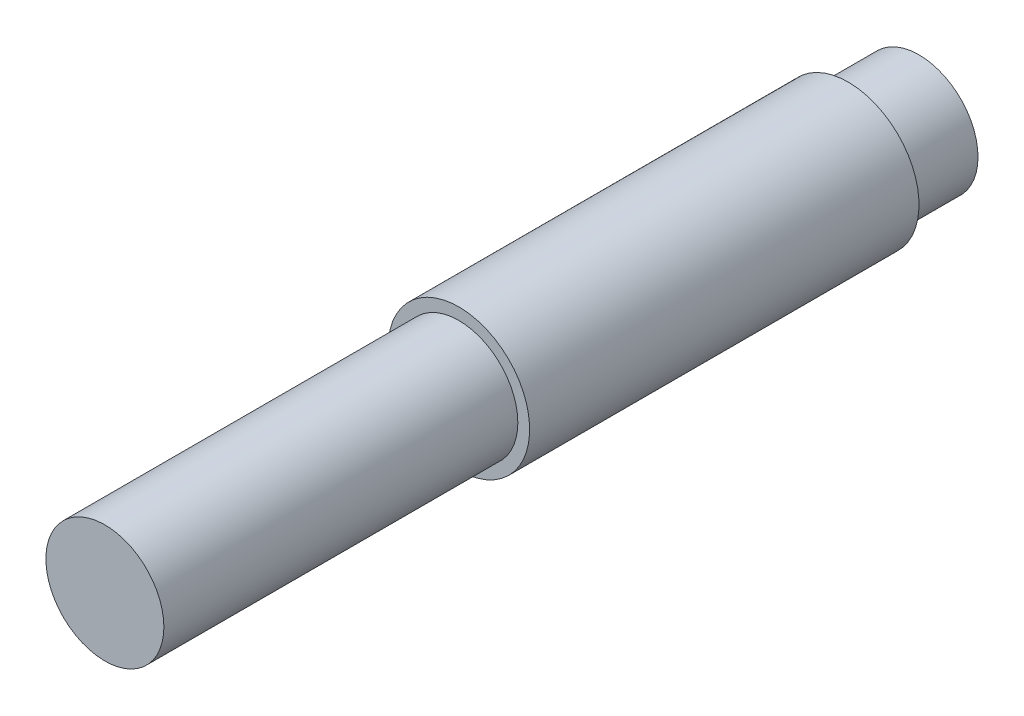
ISO-10303-21;
HEADER;
FILE_DESCRIPTION(('STEP AP214'),'2;1');
FILE_NAME('part.step','',(''),(''),'','','');
FILE_SCHEMA(('AUTOMOTIVE_DESIGN { 1 0 10303 214 1 1 1 1 }'));
ENDSEC;
DATA;
#1=APPLICATION_CONTEXT('core data for automotive mechanical design processes');
#2=APPLICATION_PROTOCOL_DEFINITION('international standard','automotive_design',2000,#1);
#3=PRODUCT_CONTEXT('',#1,'mechanical');
#4=PRODUCT('Part','Part','',(#3));
#5=PRODUCT_RELATED_PRODUCT_CATEGORY('part','',(#4));
#6=PRODUCT_DEFINITION_FORMATION('','',#4);
#7=PRODUCT_DEFINITION_CONTEXT('part definition',#1,'design');
#8=PRODUCT_DEFINITION('design','',#6,#7);
#9=PRODUCT_DEFINITION_SHAPE('','',#8);
#10=(LENGTH_UNIT() NAMED_UNIT(*) SI_UNIT(.MILLI.,.METRE.));
#11=(NAMED_UNIT(*) PLANE_ANGLE_UNIT() SI_UNIT($,.RADIAN.));
#12=(NAMED_UNIT(*) SI_UNIT($,.STERADIAN.) SOLID_ANGLE_UNIT());
#13=UNCERTAINTY_MEASURE_WITH_UNIT(LENGTH_MEASURE(1.E-05),#10,'distance_accuracy_value','');
#14=(GEOMETRIC_REPRESENTATION_CONTEXT(3) GLOBAL_UNCERTAINTY_ASSIGNED_CONTEXT((#13)) GLOBAL_UNIT_ASSIGNED_CONTEXT((#10,
#11,#12)) REPRESENTATION_CONTEXT('',''));
#15=CARTESIAN_POINT('',(0.,0.,0.));
#16=DIRECTION('',(0.,0.,1.));
#17=DIRECTION('',(1.,0.,0.));
#18=AXIS2_PLACEMENT_3D('',#15,#16,#17);
#19=CARTESIAN_POINT('',(0.280254447499223,0.00265159010575865,-3.));
#20=DIRECTION('',(0.,0.,1.));
#21=DIRECTION('',(1.,0.,0.));
#22=AXIS2_PLACEMENT_3D('',#19,#20,#21);
#23=CYLINDRICAL_SURFACE('',#22,2.5);
#24=CARTESIAN_POINT('',(0.280254447499223,0.00265159010575865,-3.));
#25=DIRECTION('',(0.,0.,1.));
#26=DIRECTION('',(1.,0.,0.));
#27=AXIS2_PLACEMENT_3D('',#24,#25,#26);
#28=CIRCLE('',#27,2.5);
#29=CARTESIAN_POINT('',(2.78025444749922,0.00265159010575865,-3.));
#30=VERTEX_POINT('',#29);
#31=EDGE_CURVE('E10',#30,#30,#28,.T.);
#32=ORIENTED_EDGE('',*,*,#31,.T.);
#33=EDGE_LOOP('',(#32));
#34=FACE_BOUND('',#33,.T.);
#35=CARTESIAN_POINT('',(0.280254447499223,0.00265159010575865,0.));
#36=DIRECTION('',(0.,0.,1.));
#37=DIRECTION('',(1.,0.,0.));
#38=AXIS2_PLACEMENT_3D('',#35,#36,#37);
#39=CIRCLE('',#38,2.5);
#40=CARTESIAN_POINT('',(2.78025444749922,0.00265159010575865,0.));
#41=VERTEX_POINT('',#40);
#42=EDGE_CURVE('E40',#41,#41,#39,.T.);
#43=ORIENTED_EDGE('',*,*,#42,.F.);
#44=EDGE_LOOP('',(#43));
#45=FACE_BOUND('',#44,.T.);
#46=ADVANCED_FACE('F37',(#34,#45),#23,.T.);
#47=CARTESIAN_POINT('',(0.280254447499223,0.00265159010575865,-3.));
#48=DIRECTION('',(0.,0.,1.));
#49=DIRECTION('',(1.,0.,0.));
#50=AXIS2_PLACEMENT_3D('',#47,#48,#49);
#51=PLANE('',#50);
#52=CARTESIAN_POINT('',(0.280254447499223,0.00265159010575865,-3.));
#53=DIRECTION('',(0.,0.,1.));
#54=DIRECTION('',(1.,0.,0.));
#55=AXIS2_PLACEMENT_3D('',#52,#53,#54);
#56=CIRCLE('',#55,1.41064659727681);
#57=CARTESIAN_POINT('',(1.69090104477603,0.00265159010575865,-3.));
#58=VERTEX_POINT('',#57);
#59=EDGE_CURVE('E47',#58,#58,#56,.T.);
#60=ORIENTED_EDGE('',*,*,#59,.T.);
#61=EDGE_LOOP('',(#60));
#62=FACE_BOUND('',#61,.T.);
#63=ORIENTED_EDGE('',*,*,#31,.F.);
#64=EDGE_LOOP('',(#63));
#65=FACE_BOUND('',#64,.T.);
#66=ADVANCED_FACE('F96',(#62,#65),#51,.F.);
#67=CARTESIAN_POINT('',(0.280254447499223,0.00265159010575865,-3.));
#68=DIRECTION('',(0.,0.,1.));
#69=DIRECTION('',(1.,0.,0.));
#70=AXIS2_PLACEMENT_3D('',#67,#68,#69);
#71=CYLINDRICAL_SURFACE('',#70,1.41064659727681);
#72=ORIENTED_EDGE('',*,*,#59,.F.);
#73=EDGE_LOOP('',(#72));
#74=FACE_BOUND('',#73,.T.);
#75=CARTESIAN_POINT('',(0.280254447499223,0.00265159010575865,0.));
#76=DIRECTION('',(0.,0.,1.));
#77=DIRECTION('',(1.,0.,0.));
#78=AXIS2_PLACEMENT_3D('',#75,#76,#77);
#79=CIRCLE('',#78,1.41064659727681);
#80=CARTESIAN_POINT('',(1.69090104477603,0.00265159010575865,0.));
#81=VERTEX_POINT('',#80);
#82=EDGE_CURVE('E51',#81,#81,#79,.F.);
#83=ORIENTED_EDGE('',*,*,#82,.F.);
#84=EDGE_LOOP('',(#83));
#85=FACE_BOUND('',#84,.T.);
#86=ADVANCED_FACE('F93',(#74,#85),#71,.F.);
#87=CARTESIAN_POINT('',(0.280254447499223,0.00265159010575865,0.));
#88=DIRECTION('',(0.,0.,1.));
#89=DIRECTION('',(1.,0.,0.));
#90=AXIS2_PLACEMENT_3D('',#87,#88,#89);
#91=PLANE('',#90);
#92=ORIENTED_EDGE('',*,*,#82,.T.);
#93=EDGE_LOOP('',(#92));
#94=FACE_BOUND('',#93,.T.);
#95=ADVANCED_FACE('F84',(#94),#91,.F.);
#96=CARTESIAN_POINT('',(0.280254447499223,0.00265159010575865,24.9852813742386));
#97=DIRECTION('',(0.,0.,-1.));
#98=DIRECTION('',(-1.,0.,0.));
#99=AXIS2_PLACEMENT_3D('',#96,#97,#98);
#100=CYLINDRICAL_SURFACE('',#99,3.);
#101=CARTESIAN_POINT('',(0.280254447499223,0.00265159010575865,0.));
#102=DIRECTION('',(0.,0.,1.));
#103=DIRECTION('',(1.,0.,0.));
#104=AXIS2_PLACEMENT_3D('',#101,#102,#103);
#105=CIRCLE('',#104,3.);
#106=CARTESIAN_POINT('',(-2.71974555250078,0.00265159010575865,0.));
#107=VERTEX_POINT('',#106);
#108=EDGE_CURVE('E57',#107,#107,#105,.T.);
#109=CARTESIAN_POINT('',(0.280254447499223,0.00265159010575865,16.5));
#110=DIRECTION('',(0.,0.,1.));
#111=DIRECTION('',(1.,0.,0.));
#112=AXIS2_PLACEMENT_3D('',#109,#110,#111);
#113=CIRCLE('',#112,3.);
#114=CARTESIAN_POINT('',(-2.71974555250078,0.00265159010575865,16.5));
#115=VERTEX_POINT('',#114);
#116=EDGE_CURVE('E54',#115,#115,#113,.T.);
#117=CARTESIAN_POINT('',(-2.71974555250078,0.00265159010575865,0.));
#118=CARTESIAN_POINT('',(-2.71974555250078,0.00265159010575865,0.171874999999996));
#119=CARTESIAN_POINT('',(-2.71974555250078,0.00265159010575865,0.343749999999996));
#120=CARTESIAN_POINT('',(-2.71974555250078,0.00265159010575865,0.687499999999996));
#121=CARTESIAN_POINT('',(-2.71974555250078,0.00265159010575865,0.859374999999997));
#122=CARTESIAN_POINT('',(-2.71974555250078,0.00265159010575865,1.203125));
#123=CARTESIAN_POINT('',(-2.71974555250078,0.00265159010575865,1.375));
#124=CARTESIAN_POINT('',(-2.71974555250078,0.00265159010575865,1.71875));
#125=CARTESIAN_POINT('',(-2.71974555250078,0.00265159010575865,1.890625));
#126=CARTESIAN_POINT('',(-2.71974555250078,0.00265159010575865,2.234375));
#127=CARTESIAN_POINT('',(-2.71974555250078,0.00265159010575865,2.40625));
#128=CARTESIAN_POINT('',(-2.71974555250078,0.00265159010575865,2.75));
#129=CARTESIAN_POINT('',(-2.71974555250078,0.00265159010575865,2.921875));
#130=CARTESIAN_POINT('',(-2.71974555250078,0.00265159010575865,3.265625));
#131=CARTESIAN_POINT('',(-2.71974555250078,0.00265159010575865,3.4375));
#132=CARTESIAN_POINT('',(-2.71974555250078,0.00265159010575865,3.78125));
#133=CARTESIAN_POINT('',(-2.71974555250078,0.00265159010575865,3.953125));
#134=CARTESIAN_POINT('',(-2.71974555250078,0.00265159010575865,4.296875));
#135=CARTESIAN_POINT('',(-2.71974555250078,0.00265159010575865,4.46875));
#136=CARTESIAN_POINT('',(-2.71974555250078,0.00265159010575865,4.8125));
#137=CARTESIAN_POINT('',(-2.71974555250078,0.00265159010575865,4.984375));
#138=CARTESIAN_POINT('',(-2.71974555250078,0.00265159010575865,5.328125));
#139=CARTESIAN_POINT('',(-2.71974555250078,0.00265159010575865,5.5));
#140=CARTESIAN_POINT('',(-2.71974555250078,0.00265159010575865,5.84375));
#141=CARTESIAN_POINT('',(-2.71974555250078,0.00265159010575865,6.015625));
#142=CARTESIAN_POINT('',(-2.71974555250078,0.00265159010575865,6.359375));
#143=CARTESIAN_POINT('',(-2.71974555250078,0.00265159010575865,6.53125));
#144=CARTESIAN_POINT('',(-2.71974555250078,0.00265159010575865,6.875));
#145=CARTESIAN_POINT('',(-2.71974555250078,0.00265159010575865,7.046875));
#146=CARTESIAN_POINT('',(-2.71974555250078,0.00265159010575865,7.390625));
#147=CARTESIAN_POINT('',(-2.71974555250078,0.00265159010575865,7.5625));
#148=CARTESIAN_POINT('',(-2.71974555250078,0.00265159010575865,7.90625));
#149=CARTESIAN_POINT('',(-2.71974555250078,0.00265159010575865,8.078125));
#150=CARTESIAN_POINT('',(-2.71974555250078,0.00265159010575865,8.421875));
#151=CARTESIAN_POINT('',(-2.71974555250078,0.00265159010575865,8.59374999999999));
#152=CARTESIAN_POINT('',(-2.71974555250078,0.00265159010575865,8.9375));
#153=CARTESIAN_POINT('',(-2.71974555250078,0.00265159010575865,9.109375));
#154=CARTESIAN_POINT('',(-2.71974555250078,0.00265159010575865,9.453125));
#155=CARTESIAN_POINT('',(-2.71974555250078,0.00265159010575865,9.625));
#156=CARTESIAN_POINT('',(-2.71974555250078,0.00265159010575865,9.96874999999999));
#157=CARTESIAN_POINT('',(-2.71974555250078,0.00265159010575865,10.140625));
#158=CARTESIAN_POINT('',(-2.71974555250078,0.00265159010575865,10.484375));
#159=CARTESIAN_POINT('',(-2.71974555250078,0.00265159010575865,10.65625));
#160=CARTESIAN_POINT('',(-2.71974555250078,0.00265159010575865,11.));
#161=CARTESIAN_POINT('',(-2.71974555250078,0.00265159010575865,11.171875));
#162=CARTESIAN_POINT('',(-2.71974555250078,0.00265159010575865,11.515625));
#163=CARTESIAN_POINT('',(-2.71974555250078,0.00265159010575865,11.6875));
#164=CARTESIAN_POINT('',(-2.71974555250078,0.00265159010575865,12.03125));
#165=CARTESIAN_POINT('',(-2.71974555250078,0.00265159010575865,12.203125));
#166=CARTESIAN_POINT('',(-2.71974555250078,0.00265159010575865,12.546875));
#167=CARTESIAN_POINT('',(-2.71974555250078,0.00265159010575865,12.71875));
#168=CARTESIAN_POINT('',(-2.71974555250078,0.00265159010575865,13.0625));
#169=CARTESIAN_POINT('',(-2.71974555250078,0.00265159010575865,13.234375));
#170=CARTESIAN_POINT('',(-2.71974555250078,0.00265159010575865,13.578125));
#171=CARTESIAN_POINT('',(-2.71974555250078,0.00265159010575865,13.75));
#172=CARTESIAN_POINT('',(-2.71974555250078,0.00265159010575865,14.09375));
#173=CARTESIAN_POINT('',(-2.71974555250078,0.00265159010575865,14.265625));
#174=CARTESIAN_POINT('',(-2.71974555250078,0.00265159010575865,14.609375));
#175=CARTESIAN_POINT('',(-2.71974555250078,0.00265159010575865,14.78125));
#176=CARTESIAN_POINT('',(-2.71974555250078,0.00265159010575865,15.125));
#177=CARTESIAN_POINT('',(-2.71974555250078,0.00265159010575865,15.296875));
#178=CARTESIAN_POINT('',(-2.71974555250078,0.00265159010575865,15.640625));
#179=CARTESIAN_POINT('',(-2.71974555250078,0.00265159010575865,15.8125));
#180=CARTESIAN_POINT('',(-2.71974555250078,0.00265159010575865,16.15625));
#181=CARTESIAN_POINT('',(-2.71974555250078,0.00265159010575865,16.328125));
#182=CARTESIAN_POINT('',(-2.71974555250078,0.00265159010575865,16.5));
#183=B_SPLINE_CURVE_WITH_KNOTS('',3,(#117,#118,#119,#120,#121,#122,#123,#124,#125,#126,#127,
#128,#129,#130,#131,#132,#133,#134,#135,#136,#137,#138,#139,#140,#141,#142,#143,#144,#145,#146,
#147,#148,#149,#150,#151,#152,#153,#154,#155,#156,#157,#158,#159,#160,#161,#162,#163,#164,#165,
#166,#167,#168,#169,#170,#171,#172,#173,#174,#175,#176,#177,#178,#179,#180,#181,#182),
.UNSPECIFIED.,.F.,.F.,(4,2,2,2,2,2,2,2,2,2,2,2,2,2,2,2,2,2,2,2,2,2,2,2,2,2,2,2,2,2,2,2,4),(0.,
0.515624999999999,1.03125,1.546875,2.0625,2.578125,3.09375,3.609375,4.125,4.640625,5.15625,
5.671875,6.1875,6.703125,7.21875,7.734375,8.25,8.765625,9.28125,9.796875,10.3125,10.828125,
11.34375,11.859375,12.375,12.890625,13.40625,13.921875,14.4375,14.953125,15.46875,15.984375,
16.5),.UNSPECIFIED.);
#184=EDGE_CURVE('BSEAM82',#107,#115,#183,.T.);
#185=ORIENTED_EDGE('',*,*,#108,.T.);
#186=ORIENTED_EDGE('',*,*,#116,.F.);
#187=ORIENTED_EDGE('',*,*,#184,.T.);
#188=ORIENTED_EDGE('',*,*,#184,.F.);
#189=EDGE_LOOP('',(#185,#187,#186,#188));
#190=FACE_BOUND('',#189,.T.);
#191=ADVANCED_FACE('F82',(#190),#100,.T.);
#192=ORIENTED_EDGE('',*,*,#42,.T.);
#193=EDGE_LOOP('',(#192));
#194=FACE_BOUND('',#193,.T.);
#195=ORIENTED_EDGE('',*,*,#108,.F.);
#196=EDGE_LOOP('',(#195));
#197=FACE_BOUND('',#196,.T.);
#198=ADVANCED_FACE('F78',(#194,#197),#91,.F.);
#199=CARTESIAN_POINT('',(-23.,23.,16.5));
#200=DIRECTION('',(0.,0.,1.));
#201=DIRECTION('',(1.,0.,0.));
#202=AXIS2_PLACEMENT_3D('',#199,#200,#201);
#203=PLANE('',#202);
#204=CARTESIAN_POINT('',(0.280254447499223,0.00265159010575865,16.5));
#205=DIRECTION('',(0.,0.,1.));
#206=DIRECTION('',(1.,0.,0.));
#207=AXIS2_PLACEMENT_3D('',#204,#205,#206);
#208=CIRCLE('',#207,2.5);
#209=CARTESIAN_POINT('',(2.78025444749922,0.00265159010575865,16.5));
#210=VERTEX_POINT('',#209);
#211=EDGE_CURVE('E61',#210,#210,#208,.T.);
#212=ORIENTED_EDGE('',*,*,#211,.F.);
#213=EDGE_LOOP('',(#212));
#214=FACE_BOUND('',#213,.T.);
#215=ORIENTED_EDGE('',*,*,#116,.T.);
#216=EDGE_LOOP('',(#215));
#217=FACE_BOUND('',#216,.T.);
#218=ADVANCED_FACE('F72',(#214,#217),#203,.T.);
#219=CARTESIAN_POINT('',(0.280254447499223,0.00265159010575865,31.5));
#220=DIRECTION('',(0.,0.,-1.));
#221=DIRECTION('',(-1.,0.,0.));
#222=AXIS2_PLACEMENT_3D('',#219,#220,#221);
#223=CYLINDRICAL_SURFACE('',#222,2.5);
#224=CARTESIAN_POINT('',(0.280254447499223,0.00265159010575865,31.5));
#225=DIRECTION('',(0.,0.,1.));
#226=DIRECTION('',(1.,0.,0.));
#227=AXIS2_PLACEMENT_3D('',#224,#225,#226);
#228=CIRCLE('',#227,2.5);
#229=CARTESIAN_POINT('',(2.78025444749922,0.00265159010575865,31.5));
#230=VERTEX_POINT('',#229);
#231=EDGE_CURVE('E60',#230,#230,#228,.T.);
#232=ORIENTED_EDGE('',*,*,#231,.F.);
#233=EDGE_LOOP('',(#232));
#234=FACE_BOUND('',#233,.T.);
#235=ORIENTED_EDGE('',*,*,#211,.T.);
#236=EDGE_LOOP('',(#235));
#237=FACE_BOUND('',#236,.T.);
#238=ADVANCED_FACE('F69',(#234,#237),#223,.T.);
#239=CARTESIAN_POINT('',(0.280254447499223,0.00265159010575865,31.5));
#240=DIRECTION('',(0.,0.,1.));
#241=DIRECTION('',(1.,0.,0.));
#242=AXIS2_PLACEMENT_3D('',#239,#240,#241);
#243=PLANE('',#242);
#244=ORIENTED_EDGE('',*,*,#231,.T.);
#245=EDGE_LOOP('',(#244));
#246=FACE_BOUND('',#245,.T.);
#247=ADVANCED_FACE('F67',(#246),#243,.T.);
#248=CLOSED_SHELL('',(#46,#66,#86,#95,#191,#198,#218,#238,#247));
#249=MANIFOLD_SOLID_BREP('B2',#248);
#250=ADVANCED_BREP_SHAPE_REPRESENTATION('',(#18,#249),#14);
#251=SHAPE_DEFINITION_REPRESENTATION(#9,#250);
ENDSEC;
END-ISO-10303-21;
